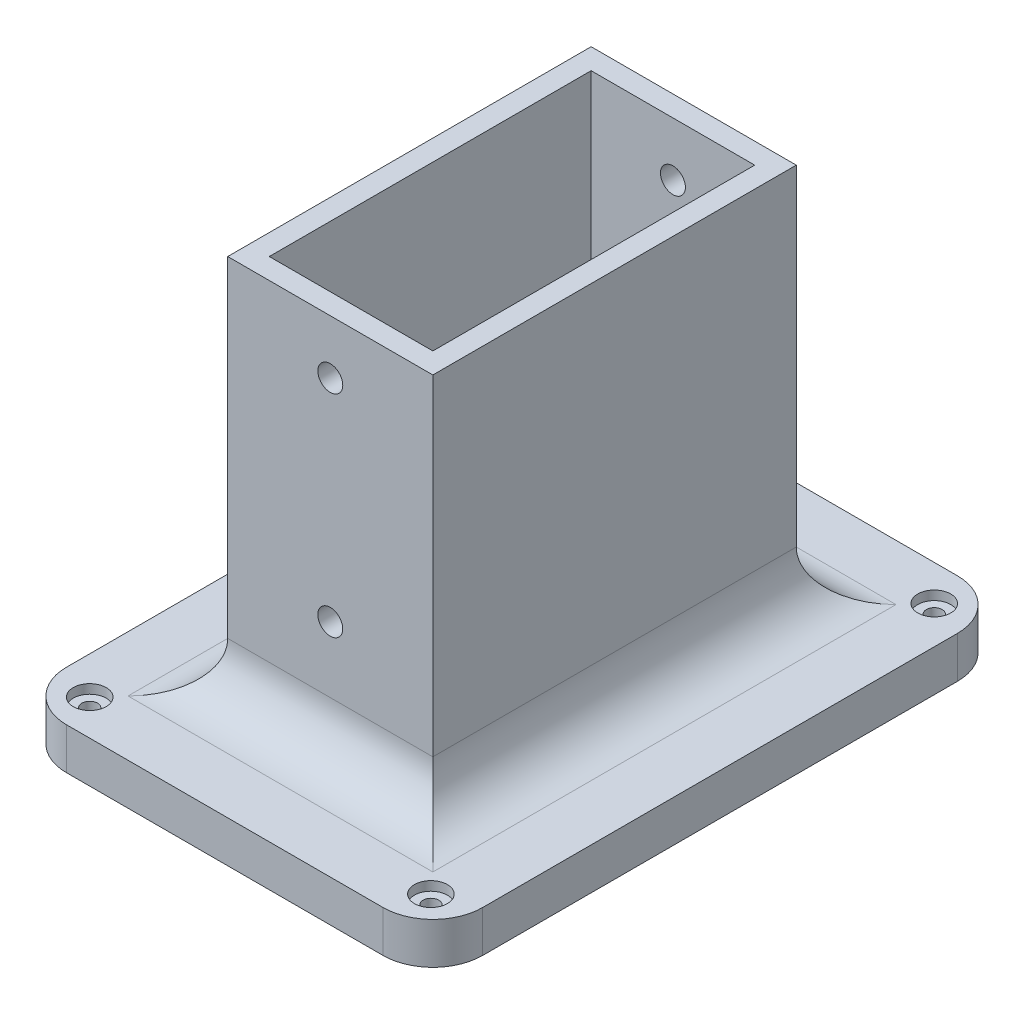
ISO-10303-21;
HEADER;
FILE_DESCRIPTION(('STEP AP214'),'2;1');
FILE_NAME('part.step','',(''),(''),'','','');
FILE_SCHEMA(('AUTOMOTIVE_DESIGN { 1 0 10303 214 1 1 1 1 }'));
ENDSEC;
DATA;
#1=APPLICATION_CONTEXT('core data for automotive mechanical design processes');
#2=APPLICATION_PROTOCOL_DEFINITION('international standard','automotive_design',2000,#1);
#3=PRODUCT_CONTEXT('',#1,'mechanical');
#4=PRODUCT('Part','Part','',(#3));
#5=PRODUCT_RELATED_PRODUCT_CATEGORY('part','',(#4));
#6=PRODUCT_DEFINITION_FORMATION('','',#4);
#7=PRODUCT_DEFINITION_CONTEXT('part definition',#1,'design');
#8=PRODUCT_DEFINITION('design','',#6,#7);
#9=PRODUCT_DEFINITION_SHAPE('','',#8);
#10=(LENGTH_UNIT() NAMED_UNIT(*) SI_UNIT(.MILLI.,.METRE.));
#11=(NAMED_UNIT(*) PLANE_ANGLE_UNIT() SI_UNIT($,.RADIAN.));
#12=(NAMED_UNIT(*) SI_UNIT($,.STERADIAN.) SOLID_ANGLE_UNIT());
#13=UNCERTAINTY_MEASURE_WITH_UNIT(LENGTH_MEASURE(1.E-05),#10,'distance_accuracy_value','');
#14=(GEOMETRIC_REPRESENTATION_CONTEXT(3) GLOBAL_UNCERTAINTY_ASSIGNED_CONTEXT((#13)) GLOBAL_UNIT_ASSIGNED_CONTEXT((#10,
#11,#12)) REPRESENTATION_CONTEXT('',''));
#15=CARTESIAN_POINT('',(0.,0.,0.));
#16=DIRECTION('',(0.,0.,1.));
#17=DIRECTION('',(1.,0.,0.));
#18=AXIS2_PLACEMENT_3D('',#15,#16,#17);
#19=CARTESIAN_POINT('',(24.685,101.6,43.735));
#20=DIRECTION('',(-1.,0.,0.));
#21=DIRECTION('',(0.,0.,1.));
#22=AXIS2_PLACEMENT_3D('',#19,#20,#21);
#23=PLANE('',#22);
#24=DIRECTION('',(0.,-1.,0.));
#25=VECTOR('',#24,1.);
#26=CARTESIAN_POINT('',(24.685,101.6,43.735));
#27=LINE('',#26,#25);
#28=CARTESIAN_POINT('',(24.685,101.6,43.735));
#29=VERTEX_POINT('',#28);
#30=CARTESIAN_POINT('',(24.685,22.,43.735));
#31=VERTEX_POINT('',#30);
#32=EDGE_CURVE('E215',#29,#31,#27,.T.);
#33=ORIENTED_EDGE('',*,*,#32,.T.);
#34=DIRECTION('',(0.,0.,1.));
#35=VECTOR('',#34,1.);
#36=CARTESIAN_POINT('',(24.685,22.,-43.735));
#37=LINE('',#36,#35);
#38=CARTESIAN_POINT('',(24.685,22.,-43.735));
#39=VERTEX_POINT('',#38);
#40=EDGE_CURVE('E234',#31,#39,#37,.F.);
#41=ORIENTED_EDGE('',*,*,#40,.T.);
#42=DIRECTION('',(0.,-1.,0.));
#43=VECTOR('',#42,1.);
#44=CARTESIAN_POINT('',(24.685,101.6,-43.735));
#45=LINE('',#44,#43);
#46=CARTESIAN_POINT('',(24.685,101.6,-43.735));
#47=VERTEX_POINT('',#46);
#48=EDGE_CURVE('E179',#47,#39,#45,.T.);
#49=ORIENTED_EDGE('',*,*,#48,.F.);
#50=DIRECTION('',(0.,0.,-1.));
#51=VECTOR('',#50,1.);
#52=CARTESIAN_POINT('',(24.685,101.6,43.735));
#53=LINE('',#52,#51);
#54=EDGE_CURVE('E206',#29,#47,#53,.T.);
#55=ORIENTED_EDGE('',*,*,#54,.F.);
#56=EDGE_LOOP('',(#33,#41,#49,#55));
#57=FACE_BOUND('',#56,.T.);
#58=ADVANCED_FACE('F41',(#57),#23,.F.);
#59=CARTESIAN_POINT('',(-24.685,101.6,-43.735));
#60=DIRECTION('',(0.,0.,1.));
#61=DIRECTION('',(1.,0.,0.));
#62=AXIS2_PLACEMENT_3D('',#59,#60,#61);
#63=PLANE('',#62);
#64=CARTESIAN_POINT('',(0.,88.6087279060162,-43.735));
#65=DIRECTION('',(0.,0.,1.));
#66=DIRECTION('',(1.,0.,0.));
#67=AXIS2_PLACEMENT_3D('',#64,#65,#66);
#68=CIRCLE('',#67,3.);
#69=CARTESIAN_POINT('',(3.,88.6087279060162,-43.735));
#70=VERTEX_POINT('',#69);
#71=EDGE_CURVE('E307',#70,#70,#68,.T.);
#72=ORIENTED_EDGE('',*,*,#71,.T.);
#73=EDGE_LOOP('',(#72));
#74=FACE_BOUND('',#73,.T.);
#75=CARTESIAN_POINT('',(0.,37.8087279060162,-43.735));
#76=DIRECTION('',(0.,0.,1.));
#77=DIRECTION('',(1.,0.,0.));
#78=AXIS2_PLACEMENT_3D('',#75,#76,#77);
#79=CIRCLE('',#78,3.);
#80=CARTESIAN_POINT('',(3.,37.8087279060162,-43.735));
#81=VERTEX_POINT('',#80);
#82=EDGE_CURVE('E292',#81,#81,#79,.T.);
#83=ORIENTED_EDGE('',*,*,#82,.T.);
#84=EDGE_LOOP('',(#83));
#85=FACE_BOUND('',#84,.T.);
#86=ORIENTED_EDGE('',*,*,#48,.T.);
#87=DIRECTION('',(1.,0.,0.));
#88=VECTOR('',#87,1.);
#89=CARTESIAN_POINT('',(-24.685,22.,-43.735));
#90=LINE('',#89,#88);
#91=CARTESIAN_POINT('',(-24.685,22.,-43.735));
#92=VERTEX_POINT('',#91);
#93=EDGE_CURVE('E237',#39,#92,#90,.F.);
#94=ORIENTED_EDGE('',*,*,#93,.T.);
#95=DIRECTION('',(0.,-1.,0.));
#96=VECTOR('',#95,1.);
#97=CARTESIAN_POINT('',(-24.685,101.6,-43.735));
#98=LINE('',#97,#96);
#99=CARTESIAN_POINT('',(-24.685,101.6,-43.735));
#100=VERTEX_POINT('',#99);
#101=EDGE_CURVE('E221',#100,#92,#98,.T.);
#102=ORIENTED_EDGE('',*,*,#101,.F.);
#103=DIRECTION('',(-1.,0.,0.));
#104=VECTOR('',#103,1.);
#105=CARTESIAN_POINT('',(-24.685,101.6,-43.735));
#106=LINE('',#105,#104);
#107=EDGE_CURVE('E209',#47,#100,#106,.T.);
#108=ORIENTED_EDGE('',*,*,#107,.F.);
#109=EDGE_LOOP('',(#86,#94,#102,#108));
#110=FACE_BOUND('',#109,.T.);
#111=ADVANCED_FACE('F418',(#74,#85,#110),#63,.F.);
#112=CARTESIAN_POINT('',(-24.685,101.6,43.735));
#113=DIRECTION('',(1.,0.,0.));
#114=DIRECTION('',(0.,0.,-1.));
#115=AXIS2_PLACEMENT_3D('',#112,#113,#114);
#116=PLANE('',#115);
#117=ORIENTED_EDGE('',*,*,#101,.T.);
#118=DIRECTION('',(0.,0.,-1.));
#119=VECTOR('',#118,1.);
#120=CARTESIAN_POINT('',(-24.685,22.,43.735));
#121=LINE('',#120,#119);
#122=CARTESIAN_POINT('',(-24.685,22.,43.735));
#123=VERTEX_POINT('',#122);
#124=EDGE_CURVE('E241',#92,#123,#121,.F.);
#125=ORIENTED_EDGE('',*,*,#124,.T.);
#126=DIRECTION('',(0.,-1.,0.));
#127=VECTOR('',#126,1.);
#128=CARTESIAN_POINT('',(-24.685,101.6,43.735));
#129=LINE('',#128,#127);
#130=CARTESIAN_POINT('',(-24.685,101.6,43.735));
#131=VERTEX_POINT('',#130);
#132=EDGE_CURVE('E218',#131,#123,#129,.T.);
#133=ORIENTED_EDGE('',*,*,#132,.F.);
#134=DIRECTION('',(0.,0.,1.));
#135=VECTOR('',#134,1.);
#136=CARTESIAN_POINT('',(-24.685,101.6,43.735));
#137=LINE('',#136,#135);
#138=EDGE_CURVE('E211',#100,#131,#137,.T.);
#139=ORIENTED_EDGE('',*,*,#138,.F.);
#140=EDGE_LOOP('',(#117,#125,#133,#139));
#141=FACE_BOUND('',#140,.T.);
#142=ADVANCED_FACE('F425',(#141),#116,.F.);
#143=CARTESIAN_POINT('',(-24.685,101.6,43.735));
#144=DIRECTION('',(0.,0.,-1.));
#145=DIRECTION('',(-1.,0.,0.));
#146=AXIS2_PLACEMENT_3D('',#143,#144,#145);
#147=PLANE('',#146);
#148=CARTESIAN_POINT('',(0.,88.6087279060162,43.735));
#149=DIRECTION('',(0.,0.,1.));
#150=DIRECTION('',(1.,0.,0.));
#151=AXIS2_PLACEMENT_3D('',#148,#149,#150);
#152=CIRCLE('',#151,3.);
#153=CARTESIAN_POINT('',(3.,88.6087279060162,43.735));
#154=VERTEX_POINT('',#153);
#155=EDGE_CURVE('E288',#154,#154,#152,.T.);
#156=ORIENTED_EDGE('',*,*,#155,.F.);
#157=EDGE_LOOP('',(#156));
#158=FACE_BOUND('',#157,.T.);
#159=CARTESIAN_POINT('',(0.,37.8087279060162,43.735));
#160=DIRECTION('',(0.,0.,1.));
#161=DIRECTION('',(1.,0.,0.));
#162=AXIS2_PLACEMENT_3D('',#159,#160,#161);
#163=CIRCLE('',#162,3.);
#164=CARTESIAN_POINT('',(3.,37.8087279060162,43.735));
#165=VERTEX_POINT('',#164);
#166=EDGE_CURVE('E295',#165,#165,#163,.T.);
#167=ORIENTED_EDGE('',*,*,#166,.F.);
#168=EDGE_LOOP('',(#167));
#169=FACE_BOUND('',#168,.T.);
#170=ORIENTED_EDGE('',*,*,#132,.T.);
#171=DIRECTION('',(-1.,0.,0.));
#172=VECTOR('',#171,1.);
#173=CARTESIAN_POINT('',(24.685,22.,43.735));
#174=LINE('',#173,#172);
#175=EDGE_CURVE('E239',#123,#31,#174,.F.);
#176=ORIENTED_EDGE('',*,*,#175,.T.);
#177=ORIENTED_EDGE('',*,*,#32,.F.);
#178=DIRECTION('',(1.,0.,0.));
#179=VECTOR('',#178,1.);
#180=CARTESIAN_POINT('',(-24.685,101.6,43.735));
#181=LINE('',#180,#179);
#182=EDGE_CURVE('E213',#131,#29,#181,.T.);
#183=ORIENTED_EDGE('',*,*,#182,.F.);
#184=EDGE_LOOP('',(#170,#176,#177,#183));
#185=FACE_BOUND('',#184,.T.);
#186=ADVANCED_FACE('F413',(#158,#169,#185),#147,.F.);
#187=CARTESIAN_POINT('',(19.685,101.6,38.735));
#188=DIRECTION('',(-1.,0.,0.));
#189=DIRECTION('',(0.,0.,1.));
#190=AXIS2_PLACEMENT_3D('',#187,#188,#189);
#191=PLANE('',#190);
#192=DIRECTION('',(0.,-1.,0.));
#193=VECTOR('',#192,1.);
#194=CARTESIAN_POINT('',(19.685,101.6,-38.735));
#195=LINE('',#194,#193);
#196=CARTESIAN_POINT('',(19.685,101.6,-38.735));
#197=VERTEX_POINT('',#196);
#198=CARTESIAN_POINT('',(19.685,9.99999999999999,-38.735));
#199=VERTEX_POINT('',#198);
#200=EDGE_CURVE('E188',#197,#199,#195,.T.);
#201=ORIENTED_EDGE('',*,*,#200,.T.);
#202=DIRECTION('',(0.,0.,1.));
#203=VECTOR('',#202,1.);
#204=CARTESIAN_POINT('',(19.685,9.99999999999999,38.735));
#205=LINE('',#204,#203);
#206=CARTESIAN_POINT('',(19.685,9.99999999999999,38.735));
#207=VERTEX_POINT('',#206);
#208=EDGE_CURVE('E171',#199,#207,#205,.T.);
#209=ORIENTED_EDGE('',*,*,#208,.T.);
#210=DIRECTION('',(0.,-1.,0.));
#211=VECTOR('',#210,1.);
#212=CARTESIAN_POINT('',(19.685,101.6,38.735));
#213=LINE('',#212,#211);
#214=CARTESIAN_POINT('',(19.685,101.6,38.735));
#215=VERTEX_POINT('',#214);
#216=EDGE_CURVE('E185',#215,#207,#213,.T.);
#217=ORIENTED_EDGE('',*,*,#216,.F.);
#218=DIRECTION('',(0.,0.,-1.));
#219=VECTOR('',#218,1.);
#220=CARTESIAN_POINT('',(19.685,101.6,38.735));
#221=LINE('',#220,#219);
#222=EDGE_CURVE('E189',#215,#197,#221,.T.);
#223=ORIENTED_EDGE('',*,*,#222,.T.);
#224=EDGE_LOOP('',(#201,#209,#217,#223));
#225=FACE_BOUND('',#224,.T.);
#226=ADVANCED_FACE('F184',(#225),#191,.T.);
#227=CARTESIAN_POINT('',(-19.685,101.6,-38.735));
#228=DIRECTION('',(0.,0.,1.));
#229=DIRECTION('',(1.,0.,0.));
#230=AXIS2_PLACEMENT_3D('',#227,#228,#229);
#231=PLANE('',#230);
#232=CARTESIAN_POINT('',(0.,88.6087279060162,-38.735));
#233=DIRECTION('',(0.,0.,1.));
#234=DIRECTION('',(1.,0.,0.));
#235=AXIS2_PLACEMENT_3D('',#232,#233,#234);
#236=CIRCLE('',#235,3.);
#237=CARTESIAN_POINT('',(3.,88.6087279060162,-38.735));
#238=VERTEX_POINT('',#237);
#239=EDGE_CURVE('E304',#238,#238,#236,.T.);
#240=ORIENTED_EDGE('',*,*,#239,.F.);
#241=EDGE_LOOP('',(#240));
#242=FACE_BOUND('',#241,.T.);
#243=CARTESIAN_POINT('',(0.,37.8087279060162,-38.735));
#244=DIRECTION('',(0.,0.,1.));
#245=DIRECTION('',(1.,0.,0.));
#246=AXIS2_PLACEMENT_3D('',#243,#244,#245);
#247=CIRCLE('',#246,3.);
#248=CARTESIAN_POINT('',(3.,37.8087279060162,-38.735));
#249=VERTEX_POINT('',#248);
#250=EDGE_CURVE('E287',#249,#249,#247,.T.);
#251=ORIENTED_EDGE('',*,*,#250,.F.);
#252=EDGE_LOOP('',(#251));
#253=FACE_BOUND('',#252,.T.);
#254=DIRECTION('',(0.,-1.,0.));
#255=VECTOR('',#254,1.);
#256=CARTESIAN_POINT('',(-19.685,101.6,-38.735));
#257=LINE('',#256,#255);
#258=CARTESIAN_POINT('',(-19.685,101.6,-38.735));
#259=VERTEX_POINT('',#258);
#260=CARTESIAN_POINT('',(-19.685,9.99999999999999,-38.735));
#261=VERTEX_POINT('',#260);
#262=EDGE_CURVE('E197',#259,#261,#257,.T.);
#263=ORIENTED_EDGE('',*,*,#262,.T.);
#264=DIRECTION('',(1.,0.,0.));
#265=VECTOR('',#264,1.);
#266=CARTESIAN_POINT('',(-19.685,9.99999999999999,-38.735));
#267=LINE('',#266,#265);
#268=EDGE_CURVE('E190',#261,#199,#267,.T.);
#269=ORIENTED_EDGE('',*,*,#268,.T.);
#270=ORIENTED_EDGE('',*,*,#200,.F.);
#271=DIRECTION('',(-1.,0.,0.));
#272=VECTOR('',#271,1.);
#273=CARTESIAN_POINT('',(-19.685,101.6,-38.735));
#274=LINE('',#273,#272);
#275=EDGE_CURVE('E392',#197,#259,#274,.T.);
#276=ORIENTED_EDGE('',*,*,#275,.T.);
#277=EDGE_LOOP('',(#263,#269,#270,#276));
#278=FACE_BOUND('',#277,.T.);
#279=ADVANCED_FACE('F402',(#242,#253,#278),#231,.T.);
#280=CARTESIAN_POINT('',(-19.685,101.6,38.735));
#281=DIRECTION('',(1.,0.,0.));
#282=DIRECTION('',(0.,0.,-1.));
#283=AXIS2_PLACEMENT_3D('',#280,#281,#282);
#284=PLANE('',#283);
#285=DIRECTION('',(0.,-1.,0.));
#286=VECTOR('',#285,1.);
#287=CARTESIAN_POINT('',(-19.685,101.6,38.735));
#288=LINE('',#287,#286);
#289=CARTESIAN_POINT('',(-19.685,101.6,38.735));
#290=VERTEX_POINT('',#289);
#291=CARTESIAN_POINT('',(-19.685,9.99999999999999,38.735));
#292=VERTEX_POINT('',#291);
#293=EDGE_CURVE('E195',#290,#292,#288,.T.);
#294=ORIENTED_EDGE('',*,*,#293,.T.);
#295=DIRECTION('',(0.,0.,-1.));
#296=VECTOR('',#295,1.);
#297=CARTESIAN_POINT('',(-19.685,9.99999999999999,38.735));
#298=LINE('',#297,#296);
#299=EDGE_CURVE('E174',#292,#261,#298,.T.);
#300=ORIENTED_EDGE('',*,*,#299,.T.);
#301=ORIENTED_EDGE('',*,*,#262,.F.);
#302=DIRECTION('',(0.,0.,1.));
#303=VECTOR('',#302,1.);
#304=CARTESIAN_POINT('',(-19.685,101.6,38.735));
#305=LINE('',#304,#303);
#306=EDGE_CURVE('E199',#259,#290,#305,.T.);
#307=ORIENTED_EDGE('',*,*,#306,.T.);
#308=EDGE_LOOP('',(#294,#300,#301,#307));
#309=FACE_BOUND('',#308,.T.);
#310=ADVANCED_FACE('F397',(#309),#284,.T.);
#311=CARTESIAN_POINT('',(-19.685,101.6,38.735));
#312=DIRECTION('',(0.,0.,-1.));
#313=DIRECTION('',(-1.,0.,0.));
#314=AXIS2_PLACEMENT_3D('',#311,#312,#313);
#315=PLANE('',#314);
#316=CARTESIAN_POINT('',(0.,88.6087279060162,38.735));
#317=DIRECTION('',(0.,0.,-1.));
#318=DIRECTION('',(-1.,0.,0.));
#319=AXIS2_PLACEMENT_3D('',#316,#317,#318);
#320=CIRCLE('',#319,3.);
#321=CARTESIAN_POINT('',(-3.,88.6087279060162,38.735));
#322=VERTEX_POINT('',#321);
#323=EDGE_CURVE('E45',#322,#322,#320,.T.);
#324=ORIENTED_EDGE('',*,*,#323,.F.);
#325=EDGE_LOOP('',(#324));
#326=FACE_BOUND('',#325,.T.);
#327=CARTESIAN_POINT('',(0.,37.8087279060162,38.735));
#328=DIRECTION('',(0.,0.,-1.));
#329=DIRECTION('',(-1.,0.,0.));
#330=AXIS2_PLACEMENT_3D('',#327,#328,#329);
#331=CIRCLE('',#330,3.);
#332=CARTESIAN_POINT('',(-3.,37.8087279060162,38.735));
#333=VERTEX_POINT('',#332);
#334=EDGE_CURVE('E285',#333,#333,#331,.T.);
#335=ORIENTED_EDGE('',*,*,#334,.F.);
#336=EDGE_LOOP('',(#335));
#337=FACE_BOUND('',#336,.T.);
#338=ORIENTED_EDGE('',*,*,#216,.T.);
#339=DIRECTION('',(-1.,0.,0.));
#340=VECTOR('',#339,1.);
#341=CARTESIAN_POINT('',(-19.685,9.99999999999999,38.735));
#342=LINE('',#341,#340);
#343=EDGE_CURVE('E168',#207,#292,#342,.T.);
#344=ORIENTED_EDGE('',*,*,#343,.T.);
#345=ORIENTED_EDGE('',*,*,#293,.F.);
#346=DIRECTION('',(1.,0.,0.));
#347=VECTOR('',#346,1.);
#348=CARTESIAN_POINT('',(-19.685,101.6,38.735));
#349=LINE('',#348,#347);
#350=EDGE_CURVE('E194',#290,#215,#349,.T.);
#351=ORIENTED_EDGE('',*,*,#350,.T.);
#352=EDGE_LOOP('',(#338,#344,#345,#351));
#353=FACE_BOUND('',#352,.T.);
#354=ADVANCED_FACE('F192',(#326,#337,#353),#315,.T.);
#355=CARTESIAN_POINT('',(0.,101.6,0.));
#356=DIRECTION('',(0.,-1.,0.));
#357=DIRECTION('',(0.,0.,-1.));
#358=AXIS2_PLACEMENT_3D('',#355,#356,#357);
#359=PLANE('',#358);
#360=ORIENTED_EDGE('',*,*,#54,.T.);
#361=ORIENTED_EDGE('',*,*,#107,.T.);
#362=ORIENTED_EDGE('',*,*,#138,.T.);
#363=ORIENTED_EDGE('',*,*,#182,.T.);
#364=EDGE_LOOP('',(#360,#361,#362,#363));
#365=FACE_BOUND('',#364,.T.);
#366=ORIENTED_EDGE('',*,*,#222,.F.);
#367=ORIENTED_EDGE('',*,*,#350,.F.);
#368=ORIENTED_EDGE('',*,*,#306,.F.);
#369=ORIENTED_EDGE('',*,*,#275,.F.);
#370=EDGE_LOOP('',(#366,#367,#368,#369));
#371=FACE_BOUND('',#370,.T.);
#372=ADVANCED_FACE('F400',(#365,#371),#359,.F.);
#373=CARTESIAN_POINT('',(0.,10.,0.));
#374=DIRECTION('',(0.,-1.,0.));
#375=DIRECTION('',(0.,0.,-1.));
#376=AXIS2_PLACEMENT_3D('',#373,#374,#375);
#377=PLANE('',#376);
#378=CARTESIAN_POINT('',(0.,10.,0.));
#379=DIRECTION('',(0.,1.,0.));
#380=DIRECTION('',(0.,0.,1.));
#381=AXIS2_PLACEMENT_3D('',#378,#379,#380);
#382=CIRCLE('',#381,3.96875);
#383=CARTESIAN_POINT('',(0.,10.,3.96875));
#384=VERTEX_POINT('',#383);
#385=EDGE_CURVE('E310',#384,#384,#382,.T.);
#386=ORIENTED_EDGE('',*,*,#385,.F.);
#387=EDGE_LOOP('',(#386));
#388=FACE_BOUND('',#387,.T.);
#389=ORIENTED_EDGE('',*,*,#208,.F.);
#390=ORIENTED_EDGE('',*,*,#268,.F.);
#391=ORIENTED_EDGE('',*,*,#299,.F.);
#392=ORIENTED_EDGE('',*,*,#343,.F.);
#393=EDGE_LOOP('',(#389,#390,#391,#392));
#394=FACE_BOUND('',#393,.T.);
#395=ADVANCED_FACE('F170',(#388,#394),#377,.F.);
#396=CARTESIAN_POINT('',(41.060456563022,10.,-60.5762500353286));
#397=DIRECTION('',(0.,1.,0.));
#398=DIRECTION('',(0.,0.,1.));
#399=AXIS2_PLACEMENT_3D('',#396,#397,#398);
#400=CIRCLE('',#399,3.96874999999999);
#401=CARTESIAN_POINT('',(41.060456563022,10.,-56.6075000353286));
#402=VERTEX_POINT('',#401);
#403=EDGE_CURVE('E322',#402,#402,#400,.T.);
#404=ORIENTED_EDGE('',*,*,#403,.F.);
#405=EDGE_LOOP('',(#404));
#406=FACE_BOUND('',#405,.T.);
#407=CARTESIAN_POINT('',(-41.060456563022,10.,60.5762500353286));
#408=DIRECTION('',(0.,1.,0.));
#409=DIRECTION('',(0.,0.,1.));
#410=AXIS2_PLACEMENT_3D('',#407,#408,#409);
#411=CIRCLE('',#410,3.96874999999999);
#412=CARTESIAN_POINT('',(-41.060456563022,10.,64.5450000353286));
#413=VERTEX_POINT('',#412);
#414=EDGE_CURVE('E334',#413,#413,#411,.T.);
#415=ORIENTED_EDGE('',*,*,#414,.F.);
#416=EDGE_LOOP('',(#415));
#417=FACE_BOUND('',#416,.T.);
#418=CARTESIAN_POINT('',(-41.060456563022,10.,-60.5762500353286));
#419=DIRECTION('',(0.,1.,0.));
#420=DIRECTION('',(0.,0.,1.));
#421=AXIS2_PLACEMENT_3D('',#418,#419,#420);
#422=CIRCLE('',#421,3.96874999999999);
#423=CARTESIAN_POINT('',(-41.060456563022,10.,-56.6075000353286));
#424=VERTEX_POINT('',#423);
#425=EDGE_CURVE('E346',#424,#424,#422,.T.);
#426=ORIENTED_EDGE('',*,*,#425,.F.);
#427=EDGE_LOOP('',(#426));
#428=FACE_BOUND('',#427,.T.);
#429=CARTESIAN_POINT('',(41.060456563022,10.,60.5762500353286));
#430=DIRECTION('',(0.,1.,0.));
#431=DIRECTION('',(0.,0.,1.));
#432=AXIS2_PLACEMENT_3D('',#429,#430,#431);
#433=CIRCLE('',#432,3.96874999999999);
#434=CARTESIAN_POINT('',(41.060456563022,10.,64.5450000353286));
#435=VERTEX_POINT('',#434);
#436=EDGE_CURVE('E358',#435,#435,#433,.T.);
#437=ORIENTED_EDGE('',*,*,#436,.F.);
#438=EDGE_LOOP('',(#437));
#439=FACE_BOUND('',#438,.T.);
#440=DIRECTION('',(1.,0.,0.));
#441=VECTOR('',#440,1.);
#442=CARTESIAN_POINT('',(24.685,10.,-55.735));
#443=LINE('',#442,#441);
#444=CARTESIAN_POINT('',(-36.685,10.,-55.735));
#445=VERTEX_POINT('',#444);
#446=CARTESIAN_POINT('',(36.685,10.,-55.735));
#447=VERTEX_POINT('',#446);
#448=EDGE_CURVE('E229',#445,#447,#443,.T.);
#449=ORIENTED_EDGE('',*,*,#448,.T.);
#450=DIRECTION('',(0.,0.,1.));
#451=VECTOR('',#450,1.);
#452=CARTESIAN_POINT('',(36.685,10.,43.735));
#453=LINE('',#452,#451);
#454=CARTESIAN_POINT('',(36.685,10.,55.735));
#455=VERTEX_POINT('',#454);
#456=EDGE_CURVE('E231',#447,#455,#453,.T.);
#457=ORIENTED_EDGE('',*,*,#456,.T.);
#458=DIRECTION('',(-1.,0.,0.));
#459=VECTOR('',#458,1.);
#460=CARTESIAN_POINT('',(-24.685,10.,55.735));
#461=LINE('',#460,#459);
#462=CARTESIAN_POINT('',(-36.685,10.,55.735));
#463=VERTEX_POINT('',#462);
#464=EDGE_CURVE('E227',#455,#463,#461,.T.);
#465=ORIENTED_EDGE('',*,*,#464,.T.);
#466=DIRECTION('',(0.,0.,-1.));
#467=VECTOR('',#466,1.);
#468=CARTESIAN_POINT('',(-36.685,10.,-43.735));
#469=LINE('',#468,#467);
#470=EDGE_CURVE('E178',#463,#445,#469,.T.);
#471=ORIENTED_EDGE('',*,*,#470,.T.);
#472=EDGE_LOOP('',(#449,#457,#465,#471));
#473=FACE_BOUND('',#472,.T.);
#474=DIRECTION('',(0.,0.,-1.));
#475=VECTOR('',#474,1.);
#476=CARTESIAN_POINT('',(50.085,10.,69.135));
#477=LINE('',#476,#475);
#478=CARTESIAN_POINT('',(50.085,10.,57.135));
#479=VERTEX_POINT('',#478);
#480=CARTESIAN_POINT('',(50.085,10.,-57.135));
#481=VERTEX_POINT('',#480);
#482=EDGE_CURVE('E369',#479,#481,#477,.T.);
#483=ORIENTED_EDGE('',*,*,#482,.T.);
#484=CARTESIAN_POINT('',(38.085,10.,-57.135));
#485=DIRECTION('',(0.,-1.,0.));
#486=DIRECTION('',(0.,0.,-1.));
#487=AXIS2_PLACEMENT_3D('',#484,#485,#486);
#488=CIRCLE('',#487,12.);
#489=CARTESIAN_POINT('',(38.085,10.,-69.135));
#490=VERTEX_POINT('',#489);
#491=EDGE_CURVE('E278',#481,#490,#488,.F.);
#492=ORIENTED_EDGE('',*,*,#491,.T.);
#493=DIRECTION('',(-1.,0.,0.));
#494=VECTOR('',#493,1.);
#495=CARTESIAN_POINT('',(-50.085,10.,-69.135));
#496=LINE('',#495,#494);
#497=CARTESIAN_POINT('',(-38.085,10.,-69.135));
#498=VERTEX_POINT('',#497);
#499=EDGE_CURVE('E372',#490,#498,#496,.T.);
#500=ORIENTED_EDGE('',*,*,#499,.T.);
#501=CARTESIAN_POINT('',(-38.085,10.,-57.135));
#502=DIRECTION('',(0.,-1.,0.));
#503=DIRECTION('',(0.,0.,-1.));
#504=AXIS2_PLACEMENT_3D('',#501,#502,#503);
#505=CIRCLE('',#504,12.);
#506=CARTESIAN_POINT('',(-50.085,10.,-57.135));
#507=VERTEX_POINT('',#506);
#508=EDGE_CURVE('E273',#498,#507,#505,.F.);
#509=ORIENTED_EDGE('',*,*,#508,.T.);
#510=DIRECTION('',(0.,0.,1.));
#511=VECTOR('',#510,1.);
#512=CARTESIAN_POINT('',(-50.085,10.,69.135));
#513=LINE('',#512,#511);
#514=CARTESIAN_POINT('',(-50.085,10.,57.135));
#515=VERTEX_POINT('',#514);
#516=EDGE_CURVE('E376',#507,#515,#513,.T.);
#517=ORIENTED_EDGE('',*,*,#516,.T.);
#518=CARTESIAN_POINT('',(-38.085,10.,57.135));
#519=DIRECTION('',(0.,-1.,0.));
#520=DIRECTION('',(0.,0.,-1.));
#521=AXIS2_PLACEMENT_3D('',#518,#519,#520);
#522=CIRCLE('',#521,12.);
#523=CARTESIAN_POINT('',(-38.085,10.,69.135));
#524=VERTEX_POINT('',#523);
#525=EDGE_CURVE('E65',#515,#524,#522,.F.);
#526=ORIENTED_EDGE('',*,*,#525,.T.);
#527=DIRECTION('',(1.,0.,0.));
#528=VECTOR('',#527,1.);
#529=CARTESIAN_POINT('',(-50.085,10.,69.135));
#530=LINE('',#529,#528);
#531=CARTESIAN_POINT('',(38.085,10.,69.135));
#532=VERTEX_POINT('',#531);
#533=EDGE_CURVE('E378',#524,#532,#530,.T.);
#534=ORIENTED_EDGE('',*,*,#533,.T.);
#535=CARTESIAN_POINT('',(38.085,10.,57.135));
#536=DIRECTION('',(0.,-1.,0.));
#537=DIRECTION('',(0.,0.,-1.));
#538=AXIS2_PLACEMENT_3D('',#535,#536,#537);
#539=CIRCLE('',#538,12.);
#540=EDGE_CURVE('E276',#532,#479,#539,.F.);
#541=ORIENTED_EDGE('',*,*,#540,.T.);
#542=EDGE_LOOP('',(#483,#492,#500,#509,#517,#526,#534,#541));
#543=FACE_BOUND('',#542,.T.);
#544=ADVANCED_FACE('F479',(#406,#417,#428,#439,#473,#543),#377,.F.);
#545=CARTESIAN_POINT('',(50.085,10.,69.135));
#546=DIRECTION('',(-1.,0.,0.));
#547=DIRECTION('',(0.,0.,1.));
#548=AXIS2_PLACEMENT_3D('',#545,#546,#547);
#549=PLANE('',#548);
#550=DIRECTION('',(0.,0.,-1.));
#551=VECTOR('',#550,1.);
#552=CARTESIAN_POINT('',(50.085,0.,69.135));
#553=LINE('',#552,#551);
#554=CARTESIAN_POINT('',(50.085,0.,57.135));
#555=VERTEX_POINT('',#554);
#556=CARTESIAN_POINT('',(50.085,0.,-57.135));
#557=VERTEX_POINT('',#556);
#558=EDGE_CURVE('E255',#555,#557,#553,.T.);
#559=ORIENTED_EDGE('',*,*,#558,.T.);
#560=DIRECTION('',(0.,-1.,0.));
#561=VECTOR('',#560,1.);
#562=CARTESIAN_POINT('',(50.085,10.,-57.135));
#563=LINE('',#562,#561);
#564=EDGE_CURVE('E271',#557,#481,#563,.F.);
#565=ORIENTED_EDGE('',*,*,#564,.T.);
#566=ORIENTED_EDGE('',*,*,#482,.F.);
#567=DIRECTION('',(0.,-1.,0.));
#568=VECTOR('',#567,1.);
#569=CARTESIAN_POINT('',(50.085,10.,57.135));
#570=LINE('',#569,#568);
#571=EDGE_CURVE('E268',#479,#555,#570,.T.);
#572=ORIENTED_EDGE('',*,*,#571,.T.);
#573=EDGE_LOOP('',(#559,#565,#566,#572));
#574=FACE_BOUND('',#573,.T.);
#575=ADVANCED_FACE('F476',(#574),#549,.F.);
#576=CARTESIAN_POINT('',(-50.085,10.,-69.135));
#577=DIRECTION('',(0.,0.,1.));
#578=DIRECTION('',(1.,0.,0.));
#579=AXIS2_PLACEMENT_3D('',#576,#577,#578);
#580=PLANE('',#579);
#581=ORIENTED_EDGE('',*,*,#499,.F.);
#582=DIRECTION('',(0.,-1.,0.));
#583=VECTOR('',#582,1.);
#584=CARTESIAN_POINT('',(38.085,10.,-69.135));
#585=LINE('',#584,#583);
#586=CARTESIAN_POINT('',(38.085,0.,-69.135));
#587=VERTEX_POINT('',#586);
#588=EDGE_CURVE('E257',#490,#587,#585,.T.);
#589=ORIENTED_EDGE('',*,*,#588,.T.);
#590=DIRECTION('',(-1.,0.,0.));
#591=VECTOR('',#590,1.);
#592=CARTESIAN_POINT('',(-50.085,0.,-69.135));
#593=LINE('',#592,#591);
#594=CARTESIAN_POINT('',(-38.085,0.,-69.135));
#595=VERTEX_POINT('',#594);
#596=EDGE_CURVE('E382',#587,#595,#593,.T.);
#597=ORIENTED_EDGE('',*,*,#596,.T.);
#598=DIRECTION('',(0.,-1.,0.));
#599=VECTOR('',#598,1.);
#600=CARTESIAN_POINT('',(-38.085,10.,-69.135));
#601=LINE('',#600,#599);
#602=EDGE_CURVE('E243',#595,#498,#601,.F.);
#603=ORIENTED_EDGE('',*,*,#602,.T.);
#604=EDGE_LOOP('',(#581,#589,#597,#603));
#605=FACE_BOUND('',#604,.T.);
#606=ADVANCED_FACE('F483',(#605),#580,.F.);
#607=CARTESIAN_POINT('',(-50.085,10.,69.135));
#608=DIRECTION('',(1.,0.,0.));
#609=DIRECTION('',(0.,0.,-1.));
#610=AXIS2_PLACEMENT_3D('',#607,#608,#609);
#611=PLANE('',#610);
#612=DIRECTION('',(0.,0.,1.));
#613=VECTOR('',#612,1.);
#614=CARTESIAN_POINT('',(-50.085,0.,69.135));
#615=LINE('',#614,#613);
#616=CARTESIAN_POINT('',(-50.085,0.,-57.135));
#617=VERTEX_POINT('',#616);
#618=CARTESIAN_POINT('',(-50.085,0.,57.135));
#619=VERTEX_POINT('',#618);
#620=EDGE_CURVE('E385',#617,#619,#615,.T.);
#621=ORIENTED_EDGE('',*,*,#620,.T.);
#622=DIRECTION('',(0.,-1.,0.));
#623=VECTOR('',#622,1.);
#624=CARTESIAN_POINT('',(-50.085,10.,57.135));
#625=LINE('',#624,#623);
#626=EDGE_CURVE('E11',#619,#515,#625,.F.);
#627=ORIENTED_EDGE('',*,*,#626,.T.);
#628=ORIENTED_EDGE('',*,*,#516,.F.);
#629=DIRECTION('',(0.,-1.,0.));
#630=VECTOR('',#629,1.);
#631=CARTESIAN_POINT('',(-50.085,10.,-57.135));
#632=LINE('',#631,#630);
#633=EDGE_CURVE('E50',#507,#617,#632,.T.);
#634=ORIENTED_EDGE('',*,*,#633,.T.);
#635=EDGE_LOOP('',(#621,#627,#628,#634));
#636=FACE_BOUND('',#635,.T.);
#637=ADVANCED_FACE('F489',(#636),#611,.F.);
#638=CARTESIAN_POINT('',(-50.085,10.,69.135));
#639=DIRECTION('',(0.,0.,-1.));
#640=DIRECTION('',(-1.,0.,0.));
#641=AXIS2_PLACEMENT_3D('',#638,#639,#640);
#642=PLANE('',#641);
#643=DIRECTION('',(1.,0.,0.));
#644=VECTOR('',#643,1.);
#645=CARTESIAN_POINT('',(-50.085,0.,69.135));
#646=LINE('',#645,#644);
#647=CARTESIAN_POINT('',(-38.085,0.,69.135));
#648=VERTEX_POINT('',#647);
#649=CARTESIAN_POINT('',(38.085,0.,69.135));
#650=VERTEX_POINT('',#649);
#651=EDGE_CURVE('E373',#648,#650,#646,.T.);
#652=ORIENTED_EDGE('',*,*,#651,.T.);
#653=DIRECTION('',(0.,-1.,0.));
#654=VECTOR('',#653,1.);
#655=CARTESIAN_POINT('',(38.085,10.,69.135));
#656=LINE('',#655,#654);
#657=EDGE_CURVE('E58',#650,#532,#656,.F.);
#658=ORIENTED_EDGE('',*,*,#657,.T.);
#659=ORIENTED_EDGE('',*,*,#533,.F.);
#660=DIRECTION('',(0.,-1.,0.));
#661=VECTOR('',#660,1.);
#662=CARTESIAN_POINT('',(-38.085,10.,69.135));
#663=LINE('',#662,#661);
#664=EDGE_CURVE('E280',#524,#648,#663,.T.);
#665=ORIENTED_EDGE('',*,*,#664,.T.);
#666=EDGE_LOOP('',(#652,#658,#659,#665));
#667=FACE_BOUND('',#666,.T.);
#668=ADVANCED_FACE('F467',(#667),#642,.F.);
#669=CARTESIAN_POINT('',(0.,0.,0.));
#670=DIRECTION('',(0.,-1.,0.));
#671=DIRECTION('',(0.,0.,-1.));
#672=AXIS2_PLACEMENT_3D('',#669,#670,#671);
#673=PLANE('',#672);
#674=CARTESIAN_POINT('',(0.,0.,0.));
#675=DIRECTION('',(0.,1.,0.));
#676=DIRECTION('',(0.,0.,1.));
#677=AXIS2_PLACEMENT_3D('',#674,#675,#676);
#678=CIRCLE('',#677,1.89865);
#679=CARTESIAN_POINT('',(0.,0.,1.89865));
#680=VERTEX_POINT('',#679);
#681=EDGE_CURVE('E319',#680,#680,#678,.T.);
#682=ORIENTED_EDGE('',*,*,#681,.T.);
#683=EDGE_LOOP('',(#682));
#684=FACE_BOUND('',#683,.T.);
#685=CARTESIAN_POINT('',(41.060456563022,0.,-60.5762500353286));
#686=DIRECTION('',(0.,1.,0.));
#687=DIRECTION('',(0.,0.,1.));
#688=AXIS2_PLACEMENT_3D('',#685,#686,#687);
#689=CIRCLE('',#688,1.89864999999999);
#690=CARTESIAN_POINT('',(41.060456563022,0.,-58.6776000353286));
#691=VERTEX_POINT('',#690);
#692=EDGE_CURVE('E331',#691,#691,#689,.T.);
#693=ORIENTED_EDGE('',*,*,#692,.T.);
#694=EDGE_LOOP('',(#693));
#695=FACE_BOUND('',#694,.T.);
#696=CARTESIAN_POINT('',(-41.060456563022,0.,60.5762500353286));
#697=DIRECTION('',(0.,1.,0.));
#698=DIRECTION('',(0.,0.,1.));
#699=AXIS2_PLACEMENT_3D('',#696,#697,#698);
#700=CIRCLE('',#699,1.89864999999999);
#701=CARTESIAN_POINT('',(-41.060456563022,0.,62.4749000353286));
#702=VERTEX_POINT('',#701);
#703=EDGE_CURVE('E343',#702,#702,#700,.T.);
#704=ORIENTED_EDGE('',*,*,#703,.T.);
#705=EDGE_LOOP('',(#704));
#706=FACE_BOUND('',#705,.T.);
#707=CARTESIAN_POINT('',(-41.060456563022,0.,-60.5762500353286));
#708=DIRECTION('',(0.,1.,0.));
#709=DIRECTION('',(0.,0.,1.));
#710=AXIS2_PLACEMENT_3D('',#707,#708,#709);
#711=CIRCLE('',#710,1.89864999999999);
#712=CARTESIAN_POINT('',(-41.060456563022,0.,-58.6776000353286));
#713=VERTEX_POINT('',#712);
#714=EDGE_CURVE('E355',#713,#713,#711,.T.);
#715=ORIENTED_EDGE('',*,*,#714,.T.);
#716=EDGE_LOOP('',(#715));
#717=FACE_BOUND('',#716,.T.);
#718=CARTESIAN_POINT('',(41.060456563022,0.,60.5762500353286));
#719=DIRECTION('',(0.,1.,0.));
#720=DIRECTION('',(0.,0.,1.));
#721=AXIS2_PLACEMENT_3D('',#718,#719,#720);
#722=CIRCLE('',#721,1.89864999999999);
#723=CARTESIAN_POINT('',(41.060456563022,0.,62.4749000353286));
#724=VERTEX_POINT('',#723);
#725=EDGE_CURVE('E247',#724,#724,#722,.T.);
#726=ORIENTED_EDGE('',*,*,#725,.T.);
#727=EDGE_LOOP('',(#726));
#728=FACE_BOUND('',#727,.T.);
#729=ORIENTED_EDGE('',*,*,#596,.F.);
#730=CARTESIAN_POINT('',(38.085,0.,-57.135));
#731=DIRECTION('',(0.,-1.,0.));
#732=DIRECTION('',(0.,0.,-1.));
#733=AXIS2_PLACEMENT_3D('',#730,#731,#732);
#734=CIRCLE('',#733,12.);
#735=EDGE_CURVE('E266',#587,#557,#734,.T.);
#736=ORIENTED_EDGE('',*,*,#735,.T.);
#737=ORIENTED_EDGE('',*,*,#558,.F.);
#738=CARTESIAN_POINT('',(38.085,0.,57.135));
#739=DIRECTION('',(0.,-1.,0.));
#740=DIRECTION('',(0.,0.,-1.));
#741=AXIS2_PLACEMENT_3D('',#738,#739,#740);
#742=CIRCLE('',#741,12.);
#743=EDGE_CURVE('E264',#555,#650,#742,.T.);
#744=ORIENTED_EDGE('',*,*,#743,.T.);
#745=ORIENTED_EDGE('',*,*,#651,.F.);
#746=CARTESIAN_POINT('',(-38.085,0.,57.135));
#747=DIRECTION('',(0.,-1.,0.));
#748=DIRECTION('',(0.,0.,-1.));
#749=AXIS2_PLACEMENT_3D('',#746,#747,#748);
#750=CIRCLE('',#749,12.);
#751=EDGE_CURVE('E262',#648,#619,#750,.T.);
#752=ORIENTED_EDGE('',*,*,#751,.T.);
#753=ORIENTED_EDGE('',*,*,#620,.F.);
#754=CARTESIAN_POINT('',(-38.085,0.,-57.135));
#755=DIRECTION('',(0.,-1.,0.));
#756=DIRECTION('',(0.,0.,-1.));
#757=AXIS2_PLACEMENT_3D('',#754,#755,#756);
#758=CIRCLE('',#757,12.);
#759=EDGE_CURVE('E260',#617,#595,#758,.T.);
#760=ORIENTED_EDGE('',*,*,#759,.T.);
#761=EDGE_LOOP('',(#729,#736,#737,#744,#745,#752,#753,#760));
#762=FACE_BOUND('',#761,.T.);
#763=ADVANCED_FACE('F446',(#684,#695,#706,#717,#728,#762),#673,.T.);
#764=CARTESIAN_POINT('',(-36.685,22.,0.));
#765=DIRECTION('',(0.,0.,1.));
#766=DIRECTION('',(1.,0.,0.));
#767=AXIS2_PLACEMENT_3D('',#764,#765,#766);
#768=CYLINDRICAL_SURFACE('',#767,12.);
#769=CARTESIAN_POINT('',(-36.685,22.,55.735));
#770=DIRECTION('',(0.707106781186547,0.,0.707106781186547));
#771=DIRECTION('',(-0.707106781186547,0.,0.707106781186547));
#772=AXIS2_PLACEMENT_3D('',#769,#770,#771);
#773=ELLIPSE('',#772,16.9705627484771,12.);
#774=EDGE_CURVE('E249',#123,#463,#773,.F.);
#775=ORIENTED_EDGE('',*,*,#774,.F.);
#776=ORIENTED_EDGE('',*,*,#124,.F.);
#777=CARTESIAN_POINT('',(-36.685,22.,-55.735));
#778=DIRECTION('',(-0.707106781186547,0.,0.707106781186547));
#779=DIRECTION('',(0.707106781186547,0.,0.707106781186547));
#780=AXIS2_PLACEMENT_3D('',#777,#778,#779);
#781=ELLIPSE('',#780,16.9705627484771,12.);
#782=EDGE_CURVE('E252',#445,#92,#781,.T.);
#783=ORIENTED_EDGE('',*,*,#782,.F.);
#784=ORIENTED_EDGE('',*,*,#470,.F.);
#785=EDGE_LOOP('',(#775,#776,#783,#784));
#786=FACE_BOUND('',#785,.T.);
#787=ADVANCED_FACE('F442',(#786),#768,.F.);
#788=CARTESIAN_POINT('',(0.,22.,-55.735));
#789=DIRECTION('',(-1.,0.,0.));
#790=DIRECTION('',(0.,0.,1.));
#791=AXIS2_PLACEMENT_3D('',#788,#789,#790);
#792=CYLINDRICAL_SURFACE('',#791,12.);
#793=ORIENTED_EDGE('',*,*,#782,.T.);
#794=ORIENTED_EDGE('',*,*,#93,.F.);
#795=CARTESIAN_POINT('',(36.685,22.,-55.735));
#796=DIRECTION('',(-0.707106781186547,0.,-0.707106781186547));
#797=DIRECTION('',(-0.707106781186547,0.,0.707106781186547));
#798=AXIS2_PLACEMENT_3D('',#795,#796,#797);
#799=ELLIPSE('',#798,16.9705627484771,12.);
#800=EDGE_CURVE('E246',#447,#39,#799,.T.);
#801=ORIENTED_EDGE('',*,*,#800,.F.);
#802=ORIENTED_EDGE('',*,*,#448,.F.);
#803=EDGE_LOOP('',(#793,#794,#801,#802));
#804=FACE_BOUND('',#803,.T.);
#805=ADVANCED_FACE('F438',(#804),#792,.F.);
#806=CARTESIAN_POINT('',(0.,22.,55.735));
#807=DIRECTION('',(1.,0.,0.));
#808=DIRECTION('',(0.,0.,-1.));
#809=AXIS2_PLACEMENT_3D('',#806,#807,#808);
#810=CYLINDRICAL_SURFACE('',#809,12.);
#811=ORIENTED_EDGE('',*,*,#774,.T.);
#812=ORIENTED_EDGE('',*,*,#464,.F.);
#813=CARTESIAN_POINT('',(36.685,22.,55.735));
#814=DIRECTION('',(0.707106781186547,0.,-0.707106781186547));
#815=DIRECTION('',(0.707106781186547,0.,0.707106781186547));
#816=AXIS2_PLACEMENT_3D('',#813,#814,#815);
#817=ELLIPSE('',#816,16.9705627484771,12.);
#818=EDGE_CURVE('E244',#31,#455,#817,.F.);
#819=ORIENTED_EDGE('',*,*,#818,.F.);
#820=ORIENTED_EDGE('',*,*,#175,.F.);
#821=EDGE_LOOP('',(#811,#812,#819,#820));
#822=FACE_BOUND('',#821,.T.);
#823=ADVANCED_FACE('F434',(#822),#810,.F.);
#824=CARTESIAN_POINT('',(36.685,22.,0.));
#825=DIRECTION('',(0.,0.,-1.));
#826=DIRECTION('',(-1.,0.,0.));
#827=AXIS2_PLACEMENT_3D('',#824,#825,#826);
#828=CYLINDRICAL_SURFACE('',#827,12.);
#829=ORIENTED_EDGE('',*,*,#800,.T.);
#830=ORIENTED_EDGE('',*,*,#40,.F.);
#831=ORIENTED_EDGE('',*,*,#818,.T.);
#832=ORIENTED_EDGE('',*,*,#456,.F.);
#833=EDGE_LOOP('',(#829,#830,#831,#832));
#834=FACE_BOUND('',#833,.T.);
#835=ADVANCED_FACE('F430',(#834),#828,.F.);
#836=CARTESIAN_POINT('',(41.060456563022,10.,60.5762500353286));
#837=DIRECTION('',(0.,1.,0.));
#838=DIRECTION('',(0.,0.,1.));
#839=AXIS2_PLACEMENT_3D('',#836,#837,#838);
#840=CYLINDRICAL_SURFACE('',#839,1.89865000000001);
#841=ORIENTED_EDGE('',*,*,#725,.F.);
#842=EDGE_LOOP('',(#841));
#843=FACE_BOUND('',#842,.T.);
#844=CARTESIAN_POINT('',(41.060456563022,7.7902,60.5762500353286));
#845=DIRECTION('',(0.,1.,0.));
#846=DIRECTION('',(0.,0.,1.));
#847=AXIS2_PLACEMENT_3D('',#844,#845,#846);
#848=CIRCLE('',#847,1.89865000000002);
#849=CARTESIAN_POINT('',(41.060456563022,7.7902,62.4749000353286));
#850=VERTEX_POINT('',#849);
#851=EDGE_CURVE('E364',#850,#850,#848,.T.);
#852=ORIENTED_EDGE('',*,*,#851,.T.);
#853=EDGE_LOOP('',(#852));
#854=FACE_BOUND('',#853,.T.);
#855=ADVANCED_FACE('F433',(#843,#854),#840,.F.);
#856=CARTESIAN_POINT('',(42.959106563022,7.7902,60.5762500353286));
#857=DIRECTION('',(0.,-1.,0.));
#858=DIRECTION('',(0.,0.,-1.));
#859=AXIS2_PLACEMENT_3D('',#856,#857,#858);
#860=PLANE('',#859);
#861=ORIENTED_EDGE('',*,*,#851,.F.);
#862=EDGE_LOOP('',(#861));
#863=FACE_BOUND('',#862,.T.);
#864=CARTESIAN_POINT('',(41.060456563022,7.7902,60.5762500353286));
#865=DIRECTION('',(0.,1.,0.));
#866=DIRECTION('',(0.,0.,1.));
#867=AXIS2_PLACEMENT_3D('',#864,#865,#866);
#868=CIRCLE('',#867,3.96874999999999);
#869=CARTESIAN_POINT('',(41.060456563022,7.7902,64.5450000353286));
#870=VERTEX_POINT('',#869);
#871=EDGE_CURVE('E361',#870,#870,#868,.T.);
#872=ORIENTED_EDGE('',*,*,#871,.T.);
#873=EDGE_LOOP('',(#872));
#874=FACE_BOUND('',#873,.T.);
#875=ADVANCED_FACE('F576',(#863,#874),#860,.F.);
#876=CARTESIAN_POINT('',(41.060456563022,10.,60.5762500353286));
#877=DIRECTION('',(0.,1.,0.));
#878=DIRECTION('',(0.,0.,1.));
#879=AXIS2_PLACEMENT_3D('',#876,#877,#878);
#880=CYLINDRICAL_SURFACE('',#879,3.96874999999999);
#881=ORIENTED_EDGE('',*,*,#871,.F.);
#882=EDGE_LOOP('',(#881));
#883=FACE_BOUND('',#882,.T.);
#884=ORIENTED_EDGE('',*,*,#436,.T.);
#885=EDGE_LOOP('',(#884));
#886=FACE_BOUND('',#885,.T.);
#887=ADVANCED_FACE('F582',(#883,#886),#880,.F.);
#888=CARTESIAN_POINT('',(-41.060456563022,10.,-60.5762500353286));
#889=DIRECTION('',(0.,1.,0.));
#890=DIRECTION('',(0.,0.,1.));
#891=AXIS2_PLACEMENT_3D('',#888,#889,#890);
#892=CYLINDRICAL_SURFACE('',#891,1.89865000000001);
#893=ORIENTED_EDGE('',*,*,#714,.F.);
#894=EDGE_LOOP('',(#893));
#895=FACE_BOUND('',#894,.T.);
#896=CARTESIAN_POINT('',(-41.060456563022,7.7902,-60.5762500353286));
#897=DIRECTION('',(0.,1.,0.));
#898=DIRECTION('',(0.,0.,1.));
#899=AXIS2_PLACEMENT_3D('',#896,#897,#898);
#900=CIRCLE('',#899,1.89865000000002);
#901=CARTESIAN_POINT('',(-41.060456563022,7.7902,-58.6776000353286));
#902=VERTEX_POINT('',#901);
#903=EDGE_CURVE('E352',#902,#902,#900,.T.);
#904=ORIENTED_EDGE('',*,*,#903,.T.);
#905=EDGE_LOOP('',(#904));
#906=FACE_BOUND('',#905,.T.);
#907=ADVANCED_FACE('F588',(#895,#906),#892,.F.);
#908=CARTESIAN_POINT('',(-39.1618065630219,7.7902,-60.5762500353286));
#909=DIRECTION('',(0.,-1.,0.));
#910=DIRECTION('',(0.,0.,-1.));
#911=AXIS2_PLACEMENT_3D('',#908,#909,#910);
#912=PLANE('',#911);
#913=ORIENTED_EDGE('',*,*,#903,.F.);
#914=EDGE_LOOP('',(#913));
#915=FACE_BOUND('',#914,.T.);
#916=CARTESIAN_POINT('',(-41.060456563022,7.7902,-60.5762500353286));
#917=DIRECTION('',(0.,1.,0.));
#918=DIRECTION('',(0.,0.,1.));
#919=AXIS2_PLACEMENT_3D('',#916,#917,#918);
#920=CIRCLE('',#919,3.96874999999999);
#921=CARTESIAN_POINT('',(-41.060456563022,7.7902,-56.6075000353286));
#922=VERTEX_POINT('',#921);
#923=EDGE_CURVE('E349',#922,#922,#920,.T.);
#924=ORIENTED_EDGE('',*,*,#923,.T.);
#925=EDGE_LOOP('',(#924));
#926=FACE_BOUND('',#925,.T.);
#927=ADVANCED_FACE('F604',(#915,#926),#912,.F.);
#928=CARTESIAN_POINT('',(-41.060456563022,10.,-60.5762500353286));
#929=DIRECTION('',(0.,1.,0.));
#930=DIRECTION('',(0.,0.,1.));
#931=AXIS2_PLACEMENT_3D('',#928,#929,#930);
#932=CYLINDRICAL_SURFACE('',#931,3.96874999999999);
#933=ORIENTED_EDGE('',*,*,#923,.F.);
#934=EDGE_LOOP('',(#933));
#935=FACE_BOUND('',#934,.T.);
#936=ORIENTED_EDGE('',*,*,#425,.T.);
#937=EDGE_LOOP('',(#936));
#938=FACE_BOUND('',#937,.T.);
#939=ADVANCED_FACE('F608',(#935,#938),#932,.F.);
#940=CARTESIAN_POINT('',(-41.060456563022,10.,60.5762500353286));
#941=DIRECTION('',(0.,1.,0.));
#942=DIRECTION('',(0.,0.,1.));
#943=AXIS2_PLACEMENT_3D('',#940,#941,#942);
#944=CYLINDRICAL_SURFACE('',#943,1.89865000000001);
#945=ORIENTED_EDGE('',*,*,#703,.F.);
#946=EDGE_LOOP('',(#945));
#947=FACE_BOUND('',#946,.T.);
#948=CARTESIAN_POINT('',(-41.060456563022,7.7902,60.5762500353286));
#949=DIRECTION('',(0.,1.,0.));
#950=DIRECTION('',(0.,0.,1.));
#951=AXIS2_PLACEMENT_3D('',#948,#949,#950);
#952=CIRCLE('',#951,1.89865000000002);
#953=CARTESIAN_POINT('',(-41.060456563022,7.7902,62.4749000353286));
#954=VERTEX_POINT('',#953);
#955=EDGE_CURVE('E340',#954,#954,#952,.T.);
#956=ORIENTED_EDGE('',*,*,#955,.T.);
#957=EDGE_LOOP('',(#956));
#958=FACE_BOUND('',#957,.T.);
#959=ADVANCED_FACE('F612',(#947,#958),#944,.F.);
#960=CARTESIAN_POINT('',(-39.1618065630219,7.7902,60.5762500353286));
#961=DIRECTION('',(0.,-1.,0.));
#962=DIRECTION('',(0.,0.,-1.));
#963=AXIS2_PLACEMENT_3D('',#960,#961,#962);
#964=PLANE('',#963);
#965=ORIENTED_EDGE('',*,*,#955,.F.);
#966=EDGE_LOOP('',(#965));
#967=FACE_BOUND('',#966,.T.);
#968=CARTESIAN_POINT('',(-41.060456563022,7.7902,60.5762500353286));
#969=DIRECTION('',(0.,1.,0.));
#970=DIRECTION('',(0.,0.,1.));
#971=AXIS2_PLACEMENT_3D('',#968,#969,#970);
#972=CIRCLE('',#971,3.96874999999999);
#973=CARTESIAN_POINT('',(-41.060456563022,7.7902,64.5450000353286));
#974=VERTEX_POINT('',#973);
#975=EDGE_CURVE('E337',#974,#974,#972,.T.);
#976=ORIENTED_EDGE('',*,*,#975,.T.);
#977=EDGE_LOOP('',(#976));
#978=FACE_BOUND('',#977,.T.);
#979=ADVANCED_FACE('F616',(#967,#978),#964,.F.);
#980=CARTESIAN_POINT('',(-41.060456563022,10.,60.5762500353286));
#981=DIRECTION('',(0.,1.,0.));
#982=DIRECTION('',(0.,0.,1.));
#983=AXIS2_PLACEMENT_3D('',#980,#981,#982);
#984=CYLINDRICAL_SURFACE('',#983,3.96874999999999);
#985=ORIENTED_EDGE('',*,*,#975,.F.);
#986=EDGE_LOOP('',(#985));
#987=FACE_BOUND('',#986,.T.);
#988=ORIENTED_EDGE('',*,*,#414,.T.);
#989=EDGE_LOOP('',(#988));
#990=FACE_BOUND('',#989,.T.);
#991=ADVANCED_FACE('F620',(#987,#990),#984,.F.);
#992=CARTESIAN_POINT('',(41.060456563022,10.,-60.5762500353286));
#993=DIRECTION('',(0.,1.,0.));
#994=DIRECTION('',(0.,0.,1.));
#995=AXIS2_PLACEMENT_3D('',#992,#993,#994);
#996=CYLINDRICAL_SURFACE('',#995,1.89865000000001);
#997=ORIENTED_EDGE('',*,*,#692,.F.);
#998=EDGE_LOOP('',(#997));
#999=FACE_BOUND('',#998,.T.);
#1000=CARTESIAN_POINT('',(41.060456563022,7.7902,-60.5762500353286));
#1001=DIRECTION('',(0.,1.,0.));
#1002=DIRECTION('',(0.,0.,1.));
#1003=AXIS2_PLACEMENT_3D('',#1000,#1001,#1002);
#1004=CIRCLE('',#1003,1.89865000000002);
#1005=CARTESIAN_POINT('',(41.060456563022,7.7902,-58.6776000353286));
#1006=VERTEX_POINT('',#1005);
#1007=EDGE_CURVE('E328',#1006,#1006,#1004,.T.);
#1008=ORIENTED_EDGE('',*,*,#1007,.T.);
#1009=EDGE_LOOP('',(#1008));
#1010=FACE_BOUND('',#1009,.T.);
#1011=ADVANCED_FACE('F624',(#999,#1010),#996,.F.);
#1012=CARTESIAN_POINT('',(42.959106563022,7.7902,-60.5762500353286));
#1013=DIRECTION('',(0.,-1.,0.));
#1014=DIRECTION('',(0.,0.,-1.));
#1015=AXIS2_PLACEMENT_3D('',#1012,#1013,#1014);
#1016=PLANE('',#1015);
#1017=ORIENTED_EDGE('',*,*,#1007,.F.);
#1018=EDGE_LOOP('',(#1017));
#1019=FACE_BOUND('',#1018,.T.);
#1020=CARTESIAN_POINT('',(41.060456563022,7.7902,-60.5762500353286));
#1021=DIRECTION('',(0.,1.,0.));
#1022=DIRECTION('',(0.,0.,1.));
#1023=AXIS2_PLACEMENT_3D('',#1020,#1021,#1022);
#1024=CIRCLE('',#1023,3.96874999999999);
#1025=CARTESIAN_POINT('',(41.060456563022,7.7902,-56.6075000353286));
#1026=VERTEX_POINT('',#1025);
#1027=EDGE_CURVE('E325',#1026,#1026,#1024,.T.);
#1028=ORIENTED_EDGE('',*,*,#1027,.T.);
#1029=EDGE_LOOP('',(#1028));
#1030=FACE_BOUND('',#1029,.T.);
#1031=ADVANCED_FACE('F628',(#1019,#1030),#1016,.F.);
#1032=CARTESIAN_POINT('',(41.060456563022,10.,-60.5762500353286));
#1033=DIRECTION('',(0.,1.,0.));
#1034=DIRECTION('',(0.,0.,1.));
#1035=AXIS2_PLACEMENT_3D('',#1032,#1033,#1034);
#1036=CYLINDRICAL_SURFACE('',#1035,3.96874999999999);
#1037=ORIENTED_EDGE('',*,*,#1027,.F.);
#1038=EDGE_LOOP('',(#1037));
#1039=FACE_BOUND('',#1038,.T.);
#1040=ORIENTED_EDGE('',*,*,#403,.T.);
#1041=EDGE_LOOP('',(#1040));
#1042=FACE_BOUND('',#1041,.T.);
#1043=ADVANCED_FACE('F632',(#1039,#1042),#1036,.F.);
#1044=CARTESIAN_POINT('',(0.,10.,0.));
#1045=DIRECTION('',(0.,1.,0.));
#1046=DIRECTION('',(0.,0.,1.));
#1047=AXIS2_PLACEMENT_3D('',#1044,#1045,#1046);
#1048=CYLINDRICAL_SURFACE('',#1047,1.89865);
#1049=ORIENTED_EDGE('',*,*,#681,.F.);
#1050=EDGE_LOOP('',(#1049));
#1051=FACE_BOUND('',#1050,.T.);
#1052=CARTESIAN_POINT('',(0.,7.7902,0.));
#1053=DIRECTION('',(0.,1.,0.));
#1054=DIRECTION('',(0.,0.,1.));
#1055=AXIS2_PLACEMENT_3D('',#1052,#1053,#1054);
#1056=CIRCLE('',#1055,1.89865000000001);
#1057=CARTESIAN_POINT('',(0.,7.7902,1.89865000000001));
#1058=VERTEX_POINT('',#1057);
#1059=EDGE_CURVE('E316',#1058,#1058,#1056,.T.);
#1060=ORIENTED_EDGE('',*,*,#1059,.T.);
#1061=EDGE_LOOP('',(#1060));
#1062=FACE_BOUND('',#1061,.T.);
#1063=ADVANCED_FACE('F636',(#1051,#1062),#1048,.F.);
#1064=CARTESIAN_POINT('',(1.89865000000001,7.7902,0.));
#1065=DIRECTION('',(0.,-1.,0.));
#1066=DIRECTION('',(0.,0.,-1.));
#1067=AXIS2_PLACEMENT_3D('',#1064,#1065,#1066);
#1068=PLANE('',#1067);
#1069=ORIENTED_EDGE('',*,*,#1059,.F.);
#1070=EDGE_LOOP('',(#1069));
#1071=FACE_BOUND('',#1070,.T.);
#1072=CARTESIAN_POINT('',(0.,7.7902,0.));
#1073=DIRECTION('',(0.,1.,0.));
#1074=DIRECTION('',(0.,0.,1.));
#1075=AXIS2_PLACEMENT_3D('',#1072,#1073,#1074);
#1076=CIRCLE('',#1075,3.96875);
#1077=CARTESIAN_POINT('',(0.,7.7902,3.96875));
#1078=VERTEX_POINT('',#1077);
#1079=EDGE_CURVE('E313',#1078,#1078,#1076,.T.);
#1080=ORIENTED_EDGE('',*,*,#1079,.T.);
#1081=EDGE_LOOP('',(#1080));
#1082=FACE_BOUND('',#1081,.T.);
#1083=ADVANCED_FACE('F640',(#1071,#1082),#1068,.F.);
#1084=CARTESIAN_POINT('',(0.,10.,0.));
#1085=DIRECTION('',(0.,1.,0.));
#1086=DIRECTION('',(0.,0.,1.));
#1087=AXIS2_PLACEMENT_3D('',#1084,#1085,#1086);
#1088=CYLINDRICAL_SURFACE('',#1087,3.96875);
#1089=ORIENTED_EDGE('',*,*,#1079,.F.);
#1090=EDGE_LOOP('',(#1089));
#1091=FACE_BOUND('',#1090,.T.);
#1092=ORIENTED_EDGE('',*,*,#385,.T.);
#1093=EDGE_LOOP('',(#1092));
#1094=FACE_BOUND('',#1093,.T.);
#1095=ADVANCED_FACE('F452',(#1091,#1094),#1088,.F.);
#1096=CARTESIAN_POINT('',(38.085,10.,-57.135));
#1097=DIRECTION('',(0.,-1.,0.));
#1098=DIRECTION('',(0.,0.,-1.));
#1099=AXIS2_PLACEMENT_3D('',#1096,#1097,#1098);
#1100=CYLINDRICAL_SURFACE('',#1099,12.);
#1101=ORIENTED_EDGE('',*,*,#491,.F.);
#1102=ORIENTED_EDGE('',*,*,#564,.F.);
#1103=ORIENTED_EDGE('',*,*,#735,.F.);
#1104=ORIENTED_EDGE('',*,*,#588,.F.);
#1105=EDGE_LOOP('',(#1101,#1102,#1103,#1104));
#1106=FACE_BOUND('',#1105,.T.);
#1107=ADVANCED_FACE('F448',(#1106),#1100,.T.);
#1108=CARTESIAN_POINT('',(38.085,10.,57.135));
#1109=DIRECTION('',(0.,-1.,0.));
#1110=DIRECTION('',(0.,0.,-1.));
#1111=AXIS2_PLACEMENT_3D('',#1108,#1109,#1110);
#1112=CYLINDRICAL_SURFACE('',#1111,12.);
#1113=ORIENTED_EDGE('',*,*,#540,.F.);
#1114=ORIENTED_EDGE('',*,*,#657,.F.);
#1115=ORIENTED_EDGE('',*,*,#743,.F.);
#1116=ORIENTED_EDGE('',*,*,#571,.F.);
#1117=EDGE_LOOP('',(#1113,#1114,#1115,#1116));
#1118=FACE_BOUND('',#1117,.T.);
#1119=ADVANCED_FACE('F451',(#1118),#1112,.T.);
#1120=CARTESIAN_POINT('',(-38.085,10.,57.135));
#1121=DIRECTION('',(0.,-1.,0.));
#1122=DIRECTION('',(0.,0.,-1.));
#1123=AXIS2_PLACEMENT_3D('',#1120,#1121,#1122);
#1124=CYLINDRICAL_SURFACE('',#1123,12.);
#1125=ORIENTED_EDGE('',*,*,#525,.F.);
#1126=ORIENTED_EDGE('',*,*,#626,.F.);
#1127=ORIENTED_EDGE('',*,*,#751,.F.);
#1128=ORIENTED_EDGE('',*,*,#664,.F.);
#1129=EDGE_LOOP('',(#1125,#1126,#1127,#1128));
#1130=FACE_BOUND('',#1129,.T.);
#1131=ADVANCED_FACE('F455',(#1130),#1124,.T.);
#1132=CARTESIAN_POINT('',(-38.085,10.,-57.135));
#1133=DIRECTION('',(0.,-1.,0.));
#1134=DIRECTION('',(0.,0.,-1.));
#1135=AXIS2_PLACEMENT_3D('',#1132,#1133,#1134);
#1136=CYLINDRICAL_SURFACE('',#1135,12.);
#1137=ORIENTED_EDGE('',*,*,#508,.F.);
#1138=ORIENTED_EDGE('',*,*,#602,.F.);
#1139=ORIENTED_EDGE('',*,*,#759,.F.);
#1140=ORIENTED_EDGE('',*,*,#633,.F.);
#1141=EDGE_LOOP('',(#1137,#1138,#1139,#1140));
#1142=FACE_BOUND('',#1141,.T.);
#1143=ADVANCED_FACE('F43',(#1142),#1136,.T.);
#1144=CARTESIAN_POINT('',(0.,37.8087279060162,-69.135));
#1145=DIRECTION('',(0.,0.,1.));
#1146=DIRECTION('',(1.,0.,0.));
#1147=AXIS2_PLACEMENT_3D('',#1144,#1145,#1146);
#1148=CYLINDRICAL_SURFACE('',#1147,3.);
#1149=ORIENTED_EDGE('',*,*,#334,.T.);
#1150=EDGE_LOOP('',(#1149));
#1151=FACE_BOUND('',#1150,.T.);
#1152=ORIENTED_EDGE('',*,*,#166,.T.);
#1153=EDGE_LOOP('',(#1152));
#1154=FACE_BOUND('',#1153,.T.);
#1155=ADVANCED_FACE('F462',(#1151,#1154),#1148,.F.);
#1156=CARTESIAN_POINT('',(0.,88.6087279060162,-69.135));
#1157=DIRECTION('',(0.,0.,1.));
#1158=DIRECTION('',(1.,0.,0.));
#1159=AXIS2_PLACEMENT_3D('',#1156,#1157,#1158);
#1160=CYLINDRICAL_SURFACE('',#1159,3.);
#1161=ORIENTED_EDGE('',*,*,#323,.T.);
#1162=EDGE_LOOP('',(#1161));
#1163=FACE_BOUND('',#1162,.T.);
#1164=ORIENTED_EDGE('',*,*,#155,.T.);
#1165=EDGE_LOOP('',(#1164));
#1166=FACE_BOUND('',#1165,.T.);
#1167=ADVANCED_FACE('F513',(#1163,#1166),#1160,.F.);
#1168=ORIENTED_EDGE('',*,*,#250,.T.);
#1169=EDGE_LOOP('',(#1168));
#1170=FACE_BOUND('',#1169,.T.);
#1171=ORIENTED_EDGE('',*,*,#82,.F.);
#1172=EDGE_LOOP('',(#1171));
#1173=FACE_BOUND('',#1172,.T.);
#1174=ADVANCED_FACE('F515',(#1170,#1173),#1148,.F.);
#1175=ORIENTED_EDGE('',*,*,#239,.T.);
#1176=EDGE_LOOP('',(#1175));
#1177=FACE_BOUND('',#1176,.T.);
#1178=ORIENTED_EDGE('',*,*,#71,.F.);
#1179=EDGE_LOOP('',(#1178));
#1180=FACE_BOUND('',#1179,.T.);
#1181=ADVANCED_FACE('F517',(#1177,#1180),#1160,.F.);
#1182=CLOSED_SHELL('',(#58,#111,#142,#186,#226,#279,#310,#354,#372,#395,#544,#575,#606,#637,
#668,#763,#787,#805,#823,#835,#855,#875,#887,#907,#927,#939,#959,#979,#991,#1011,#1031,#1043,
#1063,#1083,#1095,#1107,#1119,#1131,#1143,#1155,#1167,#1174,#1181));
#1183=MANIFOLD_SOLID_BREP('B2',#1182);
#1184=ADVANCED_BREP_SHAPE_REPRESENTATION('',(#18,#1183),#14);
#1185=SHAPE_DEFINITION_REPRESENTATION(#9,#1184);
ENDSEC;
END-ISO-10303-21;
